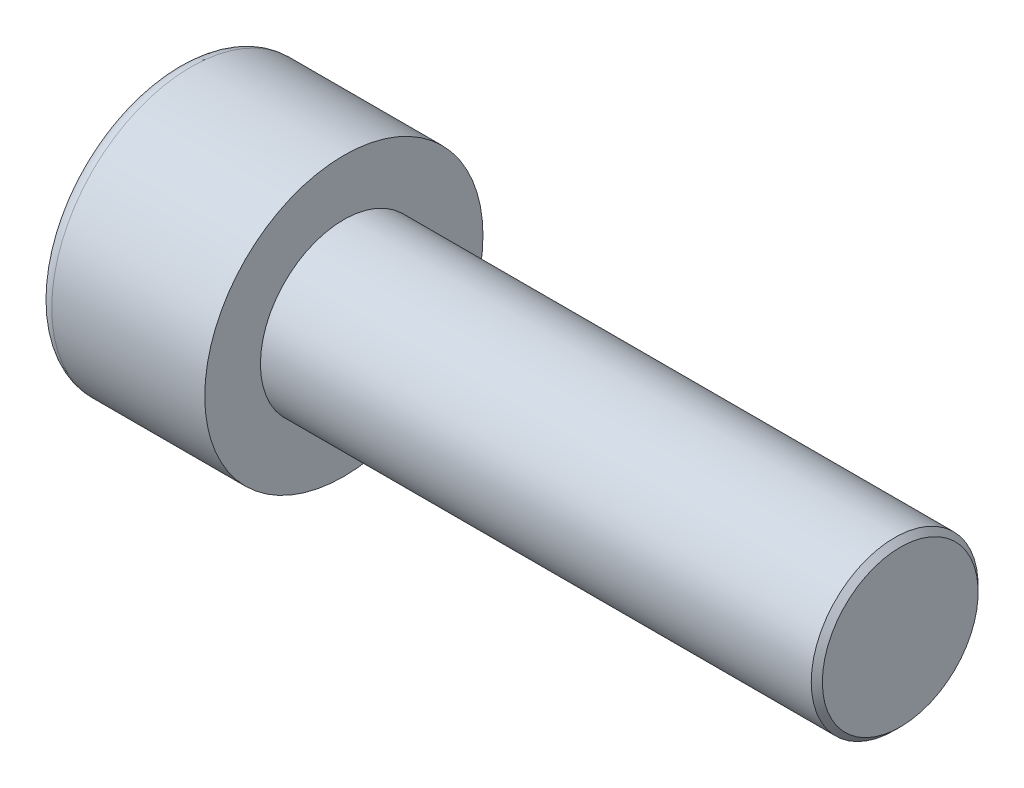
ISO-10303-21;
HEADER;
FILE_DESCRIPTION(('STEP AP214'),'2;1');
FILE_NAME('part.step','',(''),(''),'','','');
FILE_SCHEMA(('AUTOMOTIVE_DESIGN { 1 0 10303 214 1 1 1 1 }'));
ENDSEC;
DATA;
#1=APPLICATION_CONTEXT('core data for automotive mechanical design processes');
#2=APPLICATION_PROTOCOL_DEFINITION('international standard','automotive_design',2000,#1);
#3=PRODUCT_CONTEXT('',#1,'mechanical');
#4=PRODUCT('Part','Part','',(#3));
#5=PRODUCT_RELATED_PRODUCT_CATEGORY('part','',(#4));
#6=PRODUCT_DEFINITION_FORMATION('','',#4);
#7=PRODUCT_DEFINITION_CONTEXT('part definition',#1,'design');
#8=PRODUCT_DEFINITION('design','',#6,#7);
#9=PRODUCT_DEFINITION_SHAPE('','',#8);
#10=(LENGTH_UNIT() NAMED_UNIT(*) SI_UNIT(.MILLI.,.METRE.));
#11=(NAMED_UNIT(*) PLANE_ANGLE_UNIT() SI_UNIT($,.RADIAN.));
#12=(NAMED_UNIT(*) SI_UNIT($,.STERADIAN.) SOLID_ANGLE_UNIT());
#13=UNCERTAINTY_MEASURE_WITH_UNIT(LENGTH_MEASURE(1.E-05),#10,'distance_accuracy_value','');
#14=(GEOMETRIC_REPRESENTATION_CONTEXT(3) GLOBAL_UNCERTAINTY_ASSIGNED_CONTEXT((#13)) GLOBAL_UNIT_ASSIGNED_CONTEXT((#10,
#11,#12)) REPRESENTATION_CONTEXT('',''));
#15=CARTESIAN_POINT('',(0.,0.,0.));
#16=DIRECTION('',(0.,0.,1.));
#17=DIRECTION('',(1.,0.,0.));
#18=AXIS2_PLACEMENT_3D('',#15,#16,#17);
#19=CARTESIAN_POINT('',(0.,0.,0.));
#20=DIRECTION('',(1.,0.,0.));
#21=DIRECTION('',(0.,0.,-1.));
#22=AXIS2_PLACEMENT_3D('',#19,#20,#21);
#23=PLANE('',#22);
#24=DIRECTION('',(0.,0.866025403784439,-0.5));
#25=VECTOR('',#24,1.);
#26=CARTESIAN_POINT('',(0.,0.,2.88675134594813));
#27=LINE('',#26,#25);
#28=CARTESIAN_POINT('',(0.,0.,2.88675134594813));
#29=VERTEX_POINT('',#28);
#30=CARTESIAN_POINT('',(0.,2.5,1.44337567297406));
#31=VERTEX_POINT('',#30);
#32=EDGE_CURVE('E91',#29,#31,#27,.T.);
#33=ORIENTED_EDGE('',*,*,#32,.F.);
#34=DIRECTION('',(0.,0.866025403784439,0.5));
#35=VECTOR('',#34,1.);
#36=CARTESIAN_POINT('',(0.,-2.5,1.44337567297406));
#37=LINE('',#36,#35);
#38=CARTESIAN_POINT('',(0.,-2.5,1.44337567297406));
#39=VERTEX_POINT('',#38);
#40=EDGE_CURVE('E33',#39,#29,#37,.T.);
#41=ORIENTED_EDGE('',*,*,#40,.F.);
#42=DIRECTION('',(0.,0.,1.));
#43=VECTOR('',#42,1.);
#44=CARTESIAN_POINT('',(0.,-2.5,-1.44337567297406));
#45=LINE('',#44,#43);
#46=CARTESIAN_POINT('',(0.,-2.5,-1.44337567297406));
#47=VERTEX_POINT('',#46);
#48=EDGE_CURVE('E106',#47,#39,#45,.T.);
#49=ORIENTED_EDGE('',*,*,#48,.F.);
#50=DIRECTION('',(0.,-0.866025403784439,0.5));
#51=VECTOR('',#50,1.);
#52=CARTESIAN_POINT('',(0.,0.,-2.88675134594813));
#53=LINE('',#52,#51);
#54=CARTESIAN_POINT('',(0.,0.,-2.88675134594813));
#55=VERTEX_POINT('',#54);
#56=EDGE_CURVE('E100',#55,#47,#53,.T.);
#57=ORIENTED_EDGE('',*,*,#56,.F.);
#58=DIRECTION('',(0.,-0.866025403784439,-0.5));
#59=VECTOR('',#58,1.);
#60=CARTESIAN_POINT('',(0.,2.5,-1.44337567297406));
#61=LINE('',#60,#59);
#62=CARTESIAN_POINT('',(0.,2.5,-1.44337567297406));
#63=VERTEX_POINT('',#62);
#64=EDGE_CURVE('E98',#63,#55,#61,.T.);
#65=ORIENTED_EDGE('',*,*,#64,.F.);
#66=DIRECTION('',(0.,0.,-1.));
#67=VECTOR('',#66,1.);
#68=CARTESIAN_POINT('',(0.,2.5,1.44337567297406));
#69=LINE('',#68,#67);
#70=EDGE_CURVE('E84',#31,#63,#69,.T.);
#71=ORIENTED_EDGE('',*,*,#70,.F.);
#72=EDGE_LOOP('',(#33,#41,#49,#57,#65,#71));
#73=FACE_BOUND('',#72,.T.);
#74=CARTESIAN_POINT('',(0.,0.,0.));
#75=DIRECTION('',(-1.,0.,0.));
#76=DIRECTION('',(0.,0.,1.));
#77=AXIS2_PLACEMENT_3D('',#74,#75,#76);
#78=CIRCLE('',#77,4.5);
#79=CARTESIAN_POINT('',(0.,0.,4.5));
#80=VERTEX_POINT('',#79);
#81=EDGE_CURVE('E12',#80,#80,#78,.T.);
#82=ORIENTED_EDGE('',*,*,#81,.T.);
#83=EDGE_LOOP('',(#82));
#84=FACE_BOUND('',#83,.T.);
#85=ADVANCED_FACE('F19',(#73,#84),#23,.F.);
#86=CARTESIAN_POINT('',(0.5,0.,0.));
#87=DIRECTION('',(-1.,0.,0.));
#88=DIRECTION('',(0.,0.,1.));
#89=AXIS2_PLACEMENT_3D('',#86,#87,#88);
#90=TOROIDAL_SURFACE('',#89,4.5,0.5);
#91=ORIENTED_EDGE('',*,*,#81,.F.);
#92=EDGE_LOOP('',(#91));
#93=FACE_BOUND('',#92,.T.);
#94=CARTESIAN_POINT('',(0.5,0.,0.));
#95=DIRECTION('',(-1.,0.,0.));
#96=DIRECTION('',(0.,0.,1.));
#97=AXIS2_PLACEMENT_3D('',#94,#95,#96);
#98=CIRCLE('',#97,5.);
#99=CARTESIAN_POINT('',(0.5,0.,5.));
#100=VERTEX_POINT('',#99);
#101=EDGE_CURVE('E26',#100,#100,#98,.T.);
#102=ORIENTED_EDGE('',*,*,#101,.T.);
#103=EDGE_LOOP('',(#102));
#104=FACE_BOUND('',#103,.T.);
#105=ADVANCED_FACE('F132',(#93,#104),#90,.T.);
#106=CARTESIAN_POINT('',(0.,0.,0.));
#107=DIRECTION('',(-1.,0.,0.));
#108=DIRECTION('',(0.,0.,1.));
#109=AXIS2_PLACEMENT_3D('',#106,#107,#108);
#110=CYLINDRICAL_SURFACE('',#109,5.);
#111=ORIENTED_EDGE('',*,*,#101,.F.);
#112=EDGE_LOOP('',(#111));
#113=FACE_BOUND('',#112,.T.);
#114=CARTESIAN_POINT('',(6.,0.,0.));
#115=DIRECTION('',(-1.,0.,0.));
#116=DIRECTION('',(0.,0.,1.));
#117=AXIS2_PLACEMENT_3D('',#114,#115,#116);
#118=CIRCLE('',#117,5.);
#119=CARTESIAN_POINT('',(6.,0.,5.));
#120=VERTEX_POINT('',#119);
#121=EDGE_CURVE('E127',#120,#120,#118,.T.);
#122=ORIENTED_EDGE('',*,*,#121,.T.);
#123=EDGE_LOOP('',(#122));
#124=FACE_BOUND('',#123,.T.);
#125=ADVANCED_FACE('F134',(#113,#124),#110,.T.);
#126=CARTESIAN_POINT('',(6.,5.,0.));
#127=DIRECTION('',(-1.,0.,0.));
#128=DIRECTION('',(0.,0.,1.));
#129=AXIS2_PLACEMENT_3D('',#126,#127,#128);
#130=PLANE('',#129);
#131=ORIENTED_EDGE('',*,*,#121,.F.);
#132=EDGE_LOOP('',(#131));
#133=FACE_BOUND('',#132,.T.);
#134=CARTESIAN_POINT('',(6.,0.,0.));
#135=DIRECTION('',(-1.,0.,0.));
#136=DIRECTION('',(0.,0.,1.));
#137=AXIS2_PLACEMENT_3D('',#134,#135,#136);
#138=CIRCLE('',#137,3.);
#139=CARTESIAN_POINT('',(6.,0.,3.));
#140=VERTEX_POINT('',#139);
#141=EDGE_CURVE('E124',#140,#140,#138,.T.);
#142=ORIENTED_EDGE('',*,*,#141,.T.);
#143=EDGE_LOOP('',(#142));
#144=FACE_BOUND('',#143,.T.);
#145=ADVANCED_FACE('F137',(#133,#144),#130,.F.);
#146=CARTESIAN_POINT('',(0.,0.,0.));
#147=DIRECTION('',(-1.,0.,0.));
#148=DIRECTION('',(0.,0.,1.));
#149=AXIS2_PLACEMENT_3D('',#146,#147,#148);
#150=CYLINDRICAL_SURFACE('',#149,3.);
#151=ORIENTED_EDGE('',*,*,#141,.F.);
#152=EDGE_LOOP('',(#151));
#153=FACE_BOUND('',#152,.T.);
#154=CARTESIAN_POINT('',(25.8,0.,0.));
#155=DIRECTION('',(-1.,0.,0.));
#156=DIRECTION('',(0.,0.,1.));
#157=AXIS2_PLACEMENT_3D('',#154,#155,#156);
#158=CIRCLE('',#157,3.);
#159=CARTESIAN_POINT('',(25.8,0.,3.));
#160=VERTEX_POINT('',#159);
#161=EDGE_CURVE('E121',#160,#160,#158,.T.);
#162=ORIENTED_EDGE('',*,*,#161,.T.);
#163=EDGE_LOOP('',(#162));
#164=FACE_BOUND('',#163,.T.);
#165=ADVANCED_FACE('F143',(#153,#164),#150,.T.);
#166=CARTESIAN_POINT('',(26.,0.,0.));
#167=DIRECTION('',(-1.,0.,0.));
#168=DIRECTION('',(0.,0.,1.));
#169=AXIS2_PLACEMENT_3D('',#166,#167,#168);
#170=CONICAL_SURFACE('',#169,2.8,0.785398163397452);
#171=ORIENTED_EDGE('',*,*,#161,.F.);
#172=EDGE_LOOP('',(#171));
#173=FACE_BOUND('',#172,.T.);
#174=CARTESIAN_POINT('',(26.,0.,0.));
#175=DIRECTION('',(-1.,0.,0.));
#176=DIRECTION('',(0.,0.,1.));
#177=AXIS2_PLACEMENT_3D('',#174,#175,#176);
#178=CIRCLE('',#177,2.8);
#179=CARTESIAN_POINT('',(26.,0.,2.8));
#180=VERTEX_POINT('',#179);
#181=EDGE_CURVE('E118',#180,#180,#178,.T.);
#182=ORIENTED_EDGE('',*,*,#181,.T.);
#183=EDGE_LOOP('',(#182));
#184=FACE_BOUND('',#183,.T.);
#185=ADVANCED_FACE('F149',(#173,#184),#170,.T.);
#186=CARTESIAN_POINT('',(26.,2.8,0.));
#187=DIRECTION('',(-1.,0.,0.));
#188=DIRECTION('',(0.,0.,1.));
#189=AXIS2_PLACEMENT_3D('',#186,#187,#188);
#190=PLANE('',#189);
#191=ORIENTED_EDGE('',*,*,#181,.F.);
#192=EDGE_LOOP('',(#191));
#193=FACE_BOUND('',#192,.T.);
#194=ADVANCED_FACE('F155',(#193),#190,.F.);
#195=CARTESIAN_POINT('',(13.6376261582597,-2.5,1.44337567297406));
#196=DIRECTION('',(0.,-0.5,0.866025403784439));
#197=DIRECTION('',(0.,-0.866025403784439,-0.5));
#198=AXIS2_PLACEMENT_3D('',#195,#196,#197);
#199=PLANE('',#198);
#200=DIRECTION('',(0.,-0.866025403784439,-0.5));
#201=VECTOR('',#200,1.);
#202=CARTESIAN_POINT('',(4.,-2.5,1.44337567297406));
#203=LINE('',#202,#201);
#204=CARTESIAN_POINT('',(4.,0.,2.88675134594813));
#205=VERTEX_POINT('',#204);
#206=CARTESIAN_POINT('',(4.,-2.5,1.44337567297406));
#207=VERTEX_POINT('',#206);
#208=EDGE_CURVE('E52',#205,#207,#203,.T.);
#209=ORIENTED_EDGE('',*,*,#208,.T.);
#210=DIRECTION('',(-1.,0.,0.));
#211=VECTOR('',#210,1.);
#212=CARTESIAN_POINT('',(13.6376261582597,-2.5,1.44337567297406));
#213=LINE('',#212,#211);
#214=EDGE_CURVE('E109',#207,#39,#213,.T.);
#215=ORIENTED_EDGE('',*,*,#214,.T.);
#216=ORIENTED_EDGE('',*,*,#40,.T.);
#217=DIRECTION('',(-1.,0.,0.));
#218=VECTOR('',#217,1.);
#219=CARTESIAN_POINT('',(13.6376261582597,0.,2.88675134594813));
#220=LINE('',#219,#218);
#221=EDGE_CURVE('E88',#205,#29,#220,.T.);
#222=ORIENTED_EDGE('',*,*,#221,.F.);
#223=EDGE_LOOP('',(#209,#215,#216,#222));
#224=FACE_BOUND('',#223,.T.);
#225=ADVANCED_FACE('F160',(#224),#199,.F.);
#226=CARTESIAN_POINT('',(13.6376261582597,-2.5,-1.44337567297406));
#227=DIRECTION('',(0.,-1.,0.));
#228=DIRECTION('',(0.,0.,-1.));
#229=AXIS2_PLACEMENT_3D('',#226,#227,#228);
#230=PLANE('',#229);
#231=DIRECTION('',(0.,0.,-1.));
#232=VECTOR('',#231,1.);
#233=CARTESIAN_POINT('',(4.,-2.5,-1.44337567297406));
#234=LINE('',#233,#232);
#235=CARTESIAN_POINT('',(4.,-2.5,-1.44337567297406));
#236=VERTEX_POINT('',#235);
#237=EDGE_CURVE('E280',#207,#236,#234,.T.);
#238=ORIENTED_EDGE('',*,*,#237,.T.);
#239=DIRECTION('',(-1.,0.,0.));
#240=VECTOR('',#239,1.);
#241=CARTESIAN_POINT('',(13.6376261582597,-2.5,-1.44337567297406));
#242=LINE('',#241,#240);
#243=EDGE_CURVE('E111',#236,#47,#242,.T.);
#244=ORIENTED_EDGE('',*,*,#243,.T.);
#245=ORIENTED_EDGE('',*,*,#48,.T.);
#246=ORIENTED_EDGE('',*,*,#214,.F.);
#247=EDGE_LOOP('',(#238,#244,#245,#246));
#248=FACE_BOUND('',#247,.T.);
#249=ADVANCED_FACE('F167',(#248),#230,.F.);
#250=CARTESIAN_POINT('',(13.6376261582597,0.,-2.88675134594813));
#251=DIRECTION('',(0.,-0.5,-0.866025403784439));
#252=DIRECTION('',(0.,0.866025403784439,-0.5));
#253=AXIS2_PLACEMENT_3D('',#250,#251,#252);
#254=PLANE('',#253);
#255=DIRECTION('',(0.,0.866025403784439,-0.5));
#256=VECTOR('',#255,1.);
#257=CARTESIAN_POINT('',(4.,0.,-2.88675134594813));
#258=LINE('',#257,#256);
#259=CARTESIAN_POINT('',(4.,0.,-2.88675134594813));
#260=VERTEX_POINT('',#259);
#261=EDGE_CURVE('E283',#236,#260,#258,.T.);
#262=ORIENTED_EDGE('',*,*,#261,.T.);
#263=DIRECTION('',(-1.,0.,0.));
#264=VECTOR('',#263,1.);
#265=CARTESIAN_POINT('',(13.6376261582597,0.,-2.88675134594813));
#266=LINE('',#265,#264);
#267=EDGE_CURVE('E113',#260,#55,#266,.T.);
#268=ORIENTED_EDGE('',*,*,#267,.T.);
#269=ORIENTED_EDGE('',*,*,#56,.T.);
#270=ORIENTED_EDGE('',*,*,#243,.F.);
#271=EDGE_LOOP('',(#262,#268,#269,#270));
#272=FACE_BOUND('',#271,.T.);
#273=ADVANCED_FACE('F231',(#272),#254,.F.);
#274=CARTESIAN_POINT('',(13.6376261582597,2.5,-1.44337567297406));
#275=DIRECTION('',(0.,0.5,-0.866025403784439));
#276=DIRECTION('',(0.,0.866025403784439,0.5));
#277=AXIS2_PLACEMENT_3D('',#274,#275,#276);
#278=PLANE('',#277);
#279=DIRECTION('',(0.,0.866025403784439,0.5));
#280=VECTOR('',#279,1.);
#281=CARTESIAN_POINT('',(4.,2.5,-1.44337567297406));
#282=LINE('',#281,#280);
#283=CARTESIAN_POINT('',(4.,2.5,-1.44337567297406));
#284=VERTEX_POINT('',#283);
#285=EDGE_CURVE('E42',#260,#284,#282,.T.);
#286=ORIENTED_EDGE('',*,*,#285,.T.);
#287=DIRECTION('',(-1.,0.,0.));
#288=VECTOR('',#287,1.);
#289=CARTESIAN_POINT('',(13.6376261582597,2.5,-1.44337567297406));
#290=LINE('',#289,#288);
#291=EDGE_CURVE('E87',#284,#63,#290,.T.);
#292=ORIENTED_EDGE('',*,*,#291,.T.);
#293=ORIENTED_EDGE('',*,*,#64,.T.);
#294=ORIENTED_EDGE('',*,*,#267,.F.);
#295=EDGE_LOOP('',(#286,#292,#293,#294));
#296=FACE_BOUND('',#295,.T.);
#297=ADVANCED_FACE('F239',(#296),#278,.F.);
#298=CARTESIAN_POINT('',(13.6376261582597,2.5,1.44337567297406));
#299=DIRECTION('',(0.,1.,0.));
#300=DIRECTION('',(0.,0.,1.));
#301=AXIS2_PLACEMENT_3D('',#298,#299,#300);
#302=PLANE('',#301);
#303=DIRECTION('',(0.,0.,1.));
#304=VECTOR('',#303,1.);
#305=CARTESIAN_POINT('',(4.,2.5,1.44337567297406));
#306=LINE('',#305,#304);
#307=CARTESIAN_POINT('',(4.,2.5,1.44337567297406));
#308=VERTEX_POINT('',#307);
#309=EDGE_CURVE('E86',#284,#308,#306,.T.);
#310=ORIENTED_EDGE('',*,*,#309,.T.);
#311=DIRECTION('',(-1.,0.,0.));
#312=VECTOR('',#311,1.);
#313=CARTESIAN_POINT('',(13.6376261582597,2.5,1.44337567297406));
#314=LINE('',#313,#312);
#315=EDGE_CURVE('E79',#308,#31,#314,.T.);
#316=ORIENTED_EDGE('',*,*,#315,.T.);
#317=ORIENTED_EDGE('',*,*,#70,.T.);
#318=ORIENTED_EDGE('',*,*,#291,.F.);
#319=EDGE_LOOP('',(#310,#316,#317,#318));
#320=FACE_BOUND('',#319,.T.);
#321=ADVANCED_FACE('F81',(#320),#302,.F.);
#322=CARTESIAN_POINT('',(13.6376261582597,0.,2.88675134594813));
#323=DIRECTION('',(0.,0.5,0.866025403784439));
#324=DIRECTION('',(0.,-0.866025403784439,0.5));
#325=AXIS2_PLACEMENT_3D('',#322,#323,#324);
#326=PLANE('',#325);
#327=DIRECTION('',(0.,-0.866025403784439,0.5));
#328=VECTOR('',#327,1.);
#329=CARTESIAN_POINT('',(4.,0.,2.88675134594813));
#330=LINE('',#329,#328);
#331=EDGE_CURVE('E61',#308,#205,#330,.T.);
#332=ORIENTED_EDGE('',*,*,#331,.T.);
#333=ORIENTED_EDGE('',*,*,#221,.T.);
#334=ORIENTED_EDGE('',*,*,#32,.T.);
#335=ORIENTED_EDGE('',*,*,#315,.F.);
#336=EDGE_LOOP('',(#332,#333,#334,#335));
#337=FACE_BOUND('',#336,.T.);
#338=ADVANCED_FACE('F92',(#337),#326,.F.);
#339=CARTESIAN_POINT('',(4.,5.,0.));
#340=DIRECTION('',(-1.,0.,0.));
#341=DIRECTION('',(0.,0.,1.));
#342=AXIS2_PLACEMENT_3D('',#339,#340,#341);
#343=PLANE('',#342);
#344=ORIENTED_EDGE('',*,*,#208,.F.);
#345=ORIENTED_EDGE('',*,*,#331,.F.);
#346=ORIENTED_EDGE('',*,*,#309,.F.);
#347=ORIENTED_EDGE('',*,*,#285,.F.);
#348=ORIENTED_EDGE('',*,*,#261,.F.);
#349=ORIENTED_EDGE('',*,*,#237,.F.);
#350=EDGE_LOOP('',(#344,#345,#346,#347,#348,#349));
#351=FACE_BOUND('',#350,.T.);
#352=ADVANCED_FACE('F262',(#351),#343,.T.);
#353=CLOSED_SHELL('',(#85,#105,#125,#145,#165,#185,#194,#225,#249,#273,#297,#321,#338,#352));
#354=MANIFOLD_SOLID_BREP('B1',#353);
#355=ADVANCED_BREP_SHAPE_REPRESENTATION('',(#18,#354),#14);
#356=SHAPE_DEFINITION_REPRESENTATION(#9,#355);
ENDSEC;
END-ISO-10303-21;
